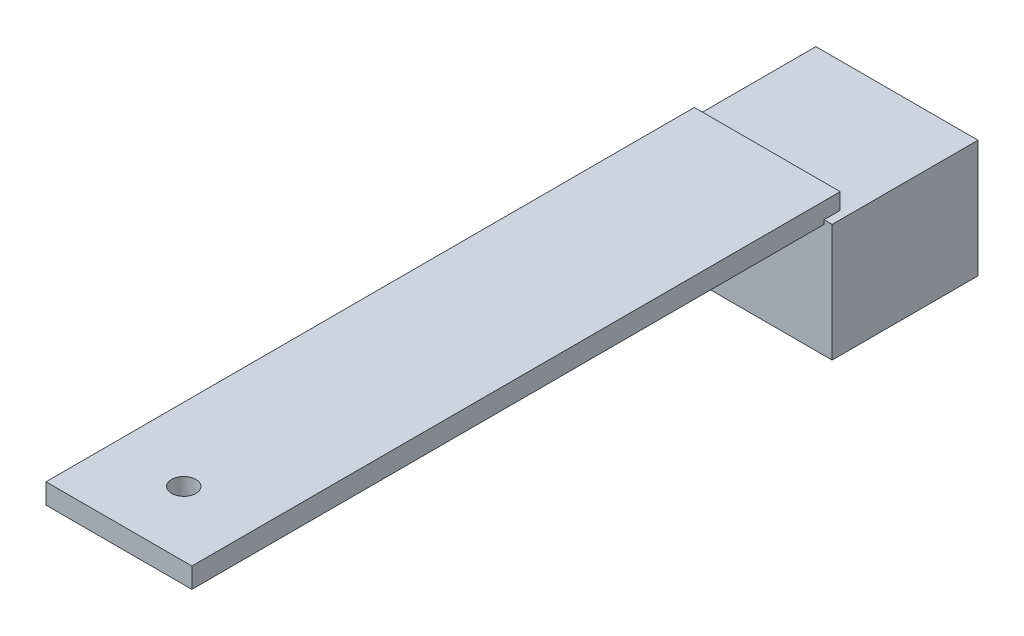
ISO-10303-21;
HEADER;
FILE_DESCRIPTION(('STEP AP214'),'2;1');
FILE_NAME('part.step','',(''),(''),'','','');
FILE_SCHEMA(('AUTOMOTIVE_DESIGN { 1 0 10303 214 1 1 1 1 }'));
ENDSEC;
DATA;
#1=APPLICATION_CONTEXT('core data for automotive mechanical design processes');
#2=APPLICATION_PROTOCOL_DEFINITION('international standard','automotive_design',2000,#1);
#3=PRODUCT_CONTEXT('',#1,'mechanical');
#4=PRODUCT('Part','Part','',(#3));
#5=PRODUCT_RELATED_PRODUCT_CATEGORY('part','',(#4));
#6=PRODUCT_DEFINITION_FORMATION('','',#4);
#7=PRODUCT_DEFINITION_CONTEXT('part definition',#1,'design');
#8=PRODUCT_DEFINITION('design','',#6,#7);
#9=PRODUCT_DEFINITION_SHAPE('','',#8);
#10=(LENGTH_UNIT() NAMED_UNIT(*) SI_UNIT(.MILLI.,.METRE.));
#11=(NAMED_UNIT(*) PLANE_ANGLE_UNIT() SI_UNIT($,.RADIAN.));
#12=(NAMED_UNIT(*) SI_UNIT($,.STERADIAN.) SOLID_ANGLE_UNIT());
#13=UNCERTAINTY_MEASURE_WITH_UNIT(LENGTH_MEASURE(1.E-05),#10,'distance_accuracy_value','');
#14=(GEOMETRIC_REPRESENTATION_CONTEXT(3) GLOBAL_UNCERTAINTY_ASSIGNED_CONTEXT((#13)) GLOBAL_UNIT_ASSIGNED_CONTEXT((#10,
#11,#12)) REPRESENTATION_CONTEXT('',''));
#15=CARTESIAN_POINT('',(0.,0.,0.));
#16=DIRECTION('',(0.,0.,1.));
#17=DIRECTION('',(1.,0.,0.));
#18=AXIS2_PLACEMENT_3D('',#15,#16,#17);
#19=CARTESIAN_POINT('',(-9.,20.7,7.99999999999999));
#20=DIRECTION('',(1.,0.,0.));
#21=DIRECTION('',(0.,0.,-1.));
#22=AXIS2_PLACEMENT_3D('',#19,#20,#21);
#23=PLANE('',#22);
#24=DIRECTION('',(0.,0.,-1.));
#25=VECTOR('',#24,1.);
#26=CARTESIAN_POINT('',(-9.,18.7,7.99999999999999));
#27=LINE('',#26,#25);
#28=CARTESIAN_POINT('',(-9.,18.7,-70.));
#29=VERTEX_POINT('',#28);
#30=CARTESIAN_POINT('',(-9.,18.7,-72.));
#31=VERTEX_POINT('',#30);
#32=EDGE_CURVE('E53',#29,#31,#27,.T.);
#33=ORIENTED_EDGE('',*,*,#32,.F.);
#34=DIRECTION('',(0.,-1.,0.));
#35=VECTOR('',#34,1.);
#36=CARTESIAN_POINT('',(-9.,20.7,-70.));
#37=LINE('',#36,#35);
#38=CARTESIAN_POINT('',(-9.,18.2,-70.));
#39=VERTEX_POINT('',#38);
#40=EDGE_CURVE('E59',#29,#39,#37,.T.);
#41=ORIENTED_EDGE('',*,*,#40,.T.);
#42=DIRECTION('',(0.,0.,-1.));
#43=VECTOR('',#42,1.);
#44=CARTESIAN_POINT('',(-9.,18.2,7.99999999999999));
#45=LINE('',#44,#43);
#46=CARTESIAN_POINT('',(-9.,18.2,7.99999999999999));
#47=VERTEX_POINT('',#46);
#48=EDGE_CURVE('E177',#47,#39,#45,.T.);
#49=ORIENTED_EDGE('',*,*,#48,.F.);
#50=DIRECTION('',(0.,-1.,0.));
#51=VECTOR('',#50,1.);
#52=CARTESIAN_POINT('',(-9.,20.7,7.99999999999999));
#53=LINE('',#52,#51);
#54=CARTESIAN_POINT('',(-9.,20.7,7.99999999999999));
#55=VERTEX_POINT('',#54);
#56=EDGE_CURVE('E153',#55,#47,#53,.T.);
#57=ORIENTED_EDGE('',*,*,#56,.F.);
#58=DIRECTION('',(0.,0.,-1.));
#59=VECTOR('',#58,1.);
#60=CARTESIAN_POINT('',(-9.,20.7,7.99999999999999));
#61=LINE('',#60,#59);
#62=CARTESIAN_POINT('',(-9.,20.7,-72.));
#63=VERTEX_POINT('',#62);
#64=EDGE_CURVE('E162',#55,#63,#61,.T.);
#65=ORIENTED_EDGE('',*,*,#64,.T.);
#66=DIRECTION('',(0.,-1.,0.));
#67=VECTOR('',#66,1.);
#68=CARTESIAN_POINT('',(-9.,20.7,-72.));
#69=LINE('',#68,#67);
#70=EDGE_CURVE('E155',#63,#31,#69,.T.);
#71=ORIENTED_EDGE('',*,*,#70,.T.);
#72=EDGE_LOOP('',(#33,#41,#49,#57,#65,#71));
#73=FACE_BOUND('',#72,.T.);
#74=ADVANCED_FACE('F39',(#73),#23,.F.);
#75=CARTESIAN_POINT('',(9.,18.2,7.99999999999999));
#76=DIRECTION('',(-1.,0.,0.));
#77=DIRECTION('',(0.,0.,1.));
#78=AXIS2_PLACEMENT_3D('',#75,#76,#77);
#79=PLANE('',#78);
#80=DIRECTION('',(0.,0.,1.));
#81=VECTOR('',#80,1.);
#82=CARTESIAN_POINT('',(9.,18.7,7.99999999999999));
#83=LINE('',#82,#81);
#84=CARTESIAN_POINT('',(9.,18.7,-72.));
#85=VERTEX_POINT('',#84);
#86=CARTESIAN_POINT('',(9.,18.7,-70.));
#87=VERTEX_POINT('',#86);
#88=EDGE_CURVE('E136',#85,#87,#83,.T.);
#89=ORIENTED_EDGE('',*,*,#88,.F.);
#90=DIRECTION('',(0.,1.,0.));
#91=VECTOR('',#90,1.);
#92=CARTESIAN_POINT('',(9.,18.2,-72.));
#93=LINE('',#92,#91);
#94=CARTESIAN_POINT('',(9.,20.7,-72.));
#95=VERTEX_POINT('',#94);
#96=EDGE_CURVE('E164',#85,#95,#93,.T.);
#97=ORIENTED_EDGE('',*,*,#96,.T.);
#98=DIRECTION('',(0.,0.,-1.));
#99=VECTOR('',#98,1.);
#100=CARTESIAN_POINT('',(9.,20.7,7.99999999999999));
#101=LINE('',#100,#99);
#102=CARTESIAN_POINT('',(9.,20.7,7.99999999999999));
#103=VERTEX_POINT('',#102);
#104=EDGE_CURVE('E168',#103,#95,#101,.T.);
#105=ORIENTED_EDGE('',*,*,#104,.F.);
#106=DIRECTION('',(0.,1.,0.));
#107=VECTOR('',#106,1.);
#108=CARTESIAN_POINT('',(9.,18.2,7.99999999999999));
#109=LINE('',#108,#107);
#110=CARTESIAN_POINT('',(9.,18.2,7.99999999999999));
#111=VERTEX_POINT('',#110);
#112=EDGE_CURVE('E157',#111,#103,#109,.T.);
#113=ORIENTED_EDGE('',*,*,#112,.F.);
#114=DIRECTION('',(0.,0.,-1.));
#115=VECTOR('',#114,1.);
#116=CARTESIAN_POINT('',(9.,18.2,7.99999999999999));
#117=LINE('',#116,#115);
#118=CARTESIAN_POINT('',(9.,18.2,-70.));
#119=VERTEX_POINT('',#118);
#120=EDGE_CURVE('E175',#111,#119,#117,.T.);
#121=ORIENTED_EDGE('',*,*,#120,.T.);
#122=DIRECTION('',(0.,1.,0.));
#123=VECTOR('',#122,1.);
#124=CARTESIAN_POINT('',(9.,18.2,-70.));
#125=LINE('',#124,#123);
#126=EDGE_CURVE('E11',#119,#87,#125,.T.);
#127=ORIENTED_EDGE('',*,*,#126,.T.);
#128=EDGE_LOOP('',(#89,#97,#105,#113,#121,#127));
#129=FACE_BOUND('',#128,.T.);
#130=ADVANCED_FACE('F198',(#129),#79,.F.);
#131=CARTESIAN_POINT('',(0.,0.,-72.));
#132=DIRECTION('',(0.,0.,1.));
#133=DIRECTION('',(1.,0.,0.));
#134=AXIS2_PLACEMENT_3D('',#131,#132,#133);
#135=PLANE('',#134);
#136=DIRECTION('',(1.,0.,0.));
#137=VECTOR('',#136,1.);
#138=CARTESIAN_POINT('',(0.,18.7,-72.));
#139=LINE('',#138,#137);
#140=EDGE_CURVE('E50',#31,#85,#139,.T.);
#141=ORIENTED_EDGE('',*,*,#140,.F.);
#142=ORIENTED_EDGE('',*,*,#70,.F.);
#143=DIRECTION('',(-1.,0.,0.));
#144=VECTOR('',#143,1.);
#145=CARTESIAN_POINT('',(9.,20.7,-72.));
#146=LINE('',#145,#144);
#147=EDGE_CURVE('E160',#95,#63,#146,.T.);
#148=ORIENTED_EDGE('',*,*,#147,.F.);
#149=ORIENTED_EDGE('',*,*,#96,.F.);
#150=EDGE_LOOP('',(#141,#142,#148,#149));
#151=FACE_BOUND('',#150,.T.);
#152=ADVANCED_FACE('F189',(#151),#135,.F.);
#153=CARTESIAN_POINT('',(-9.,18.2,7.99999999999999));
#154=DIRECTION('',(0.,1.,0.));
#155=DIRECTION('',(0.,0.,1.));
#156=AXIS2_PLACEMENT_3D('',#153,#154,#155);
#157=PLANE('',#156);
#158=CARTESIAN_POINT('',(0.,18.2,0.));
#159=DIRECTION('',(0.,1.,0.));
#160=DIRECTION('',(0.,0.,1.));
#161=AXIS2_PLACEMENT_3D('',#158,#159,#160);
#162=CIRCLE('',#161,1.5);
#163=CARTESIAN_POINT('',(0.,18.2,1.5));
#164=VERTEX_POINT('',#163);
#165=EDGE_CURVE('E209',#164,#164,#162,.F.);
#166=ORIENTED_EDGE('',*,*,#165,.F.);
#167=EDGE_LOOP('',(#166));
#168=FACE_BOUND('',#167,.T.);
#169=ORIENTED_EDGE('',*,*,#48,.T.);
#170=DIRECTION('',(1.,0.,0.));
#171=VECTOR('',#170,1.);
#172=CARTESIAN_POINT('',(-9.,18.2,-70.));
#173=LINE('',#172,#171);
#174=EDGE_CURVE('E149',#39,#119,#173,.T.);
#175=ORIENTED_EDGE('',*,*,#174,.T.);
#176=ORIENTED_EDGE('',*,*,#120,.F.);
#177=DIRECTION('',(1.,0.,0.));
#178=VECTOR('',#177,1.);
#179=CARTESIAN_POINT('',(-9.,18.2,7.99999999999999));
#180=LINE('',#179,#178);
#181=EDGE_CURVE('E156',#47,#111,#180,.T.);
#182=ORIENTED_EDGE('',*,*,#181,.F.);
#183=EDGE_LOOP('',(#169,#175,#176,#182));
#184=FACE_BOUND('',#183,.T.);
#185=ADVANCED_FACE('F239',(#168,#184),#157,.F.);
#186=CARTESIAN_POINT('',(9.,20.7,7.99999999999999));
#187=DIRECTION('',(0.,-1.,0.));
#188=DIRECTION('',(0.,0.,-1.));
#189=AXIS2_PLACEMENT_3D('',#186,#187,#188);
#190=PLANE('',#189);
#191=CARTESIAN_POINT('',(0.,20.7,0.));
#192=DIRECTION('',(0.,-1.,0.));
#193=DIRECTION('',(0.,0.,-1.));
#194=AXIS2_PLACEMENT_3D('',#191,#192,#193);
#195=CIRCLE('',#194,1.5);
#196=CARTESIAN_POINT('',(0.,20.7,-1.5));
#197=VERTEX_POINT('',#196);
#198=EDGE_CURVE('E45',#197,#197,#195,.F.);
#199=ORIENTED_EDGE('',*,*,#198,.F.);
#200=EDGE_LOOP('',(#199));
#201=FACE_BOUND('',#200,.T.);
#202=ORIENTED_EDGE('',*,*,#147,.T.);
#203=ORIENTED_EDGE('',*,*,#64,.F.);
#204=DIRECTION('',(-1.,0.,0.));
#205=VECTOR('',#204,1.);
#206=CARTESIAN_POINT('',(9.,20.7,7.99999999999999));
#207=LINE('',#206,#205);
#208=EDGE_CURVE('E161',#103,#55,#207,.T.);
#209=ORIENTED_EDGE('',*,*,#208,.F.);
#210=ORIENTED_EDGE('',*,*,#104,.T.);
#211=EDGE_LOOP('',(#202,#203,#209,#210));
#212=FACE_BOUND('',#211,.T.);
#213=ADVANCED_FACE('F195',(#201,#212),#190,.F.);
#214=CARTESIAN_POINT('',(0.,0.,7.99999999999999));
#215=DIRECTION('',(0.,0.,1.));
#216=DIRECTION('',(1.,0.,0.));
#217=AXIS2_PLACEMENT_3D('',#214,#215,#216);
#218=PLANE('',#217);
#219=ORIENTED_EDGE('',*,*,#56,.T.);
#220=ORIENTED_EDGE('',*,*,#181,.T.);
#221=ORIENTED_EDGE('',*,*,#112,.T.);
#222=ORIENTED_EDGE('',*,*,#208,.T.);
#223=EDGE_LOOP('',(#219,#220,#221,#222));
#224=FACE_BOUND('',#223,.T.);
#225=ADVANCED_FACE('F250',(#224),#218,.T.);
#226=CARTESIAN_POINT('',(0.,0.,-70.));
#227=DIRECTION('',(0.,0.,1.));
#228=DIRECTION('',(1.,0.,0.));
#229=AXIS2_PLACEMENT_3D('',#226,#227,#228);
#230=PLANE('',#229);
#231=ORIENTED_EDGE('',*,*,#40,.F.);
#232=DIRECTION('',(-1.,0.,0.));
#233=VECTOR('',#232,1.);
#234=CARTESIAN_POINT('',(10.,18.7,-70.));
#235=LINE('',#234,#233);
#236=CARTESIAN_POINT('',(-10.,18.7,-70.));
#237=VERTEX_POINT('',#236);
#238=EDGE_CURVE('E134',#29,#237,#235,.T.);
#239=ORIENTED_EDGE('',*,*,#238,.T.);
#240=DIRECTION('',(0.,-1.,0.));
#241=VECTOR('',#240,1.);
#242=CARTESIAN_POINT('',(-10.,18.7,-70.));
#243=LINE('',#242,#241);
#244=CARTESIAN_POINT('',(-10.,4.2,-70.));
#245=VERTEX_POINT('',#244);
#246=EDGE_CURVE('E127',#237,#245,#243,.T.);
#247=ORIENTED_EDGE('',*,*,#246,.T.);
#248=DIRECTION('',(1.,0.,0.));
#249=VECTOR('',#248,1.);
#250=CARTESIAN_POINT('',(-10.,4.2,-70.));
#251=LINE('',#250,#249);
#252=CARTESIAN_POINT('',(10.,4.2,-70.));
#253=VERTEX_POINT('',#252);
#254=EDGE_CURVE('E113',#245,#253,#251,.T.);
#255=ORIENTED_EDGE('',*,*,#254,.T.);
#256=DIRECTION('',(0.,1.,0.));
#257=VECTOR('',#256,1.);
#258=CARTESIAN_POINT('',(10.,4.2,-70.));
#259=LINE('',#258,#257);
#260=CARTESIAN_POINT('',(10.,18.7,-70.));
#261=VERTEX_POINT('',#260);
#262=EDGE_CURVE('E121',#253,#261,#259,.T.);
#263=ORIENTED_EDGE('',*,*,#262,.T.);
#264=EDGE_CURVE('E199',#261,#87,#235,.T.);
#265=ORIENTED_EDGE('',*,*,#264,.T.);
#266=ORIENTED_EDGE('',*,*,#126,.F.);
#267=ORIENTED_EDGE('',*,*,#174,.F.);
#268=EDGE_LOOP('',(#231,#239,#247,#255,#263,#265,#266,#267));
#269=FACE_BOUND('',#268,.T.);
#270=ADVANCED_FACE('F129',(#269),#230,.T.);
#271=CARTESIAN_POINT('',(10.,18.7,-70.));
#272=DIRECTION('',(0.,-1.,0.));
#273=DIRECTION('',(0.,0.,-1.));
#274=AXIS2_PLACEMENT_3D('',#271,#272,#273);
#275=PLANE('',#274);
#276=ORIENTED_EDGE('',*,*,#238,.F.);
#277=ORIENTED_EDGE('',*,*,#32,.T.);
#278=ORIENTED_EDGE('',*,*,#140,.T.);
#279=ORIENTED_EDGE('',*,*,#88,.T.);
#280=ORIENTED_EDGE('',*,*,#264,.F.);
#281=DIRECTION('',(0.,0.,-1.));
#282=VECTOR('',#281,1.);
#283=CARTESIAN_POINT('',(10.,18.7,-70.));
#284=LINE('',#283,#282);
#285=CARTESIAN_POINT('',(10.,18.7,-88.));
#286=VERTEX_POINT('',#285);
#287=EDGE_CURVE('E145',#261,#286,#284,.T.);
#288=ORIENTED_EDGE('',*,*,#287,.T.);
#289=DIRECTION('',(-1.,0.,0.));
#290=VECTOR('',#289,1.);
#291=CARTESIAN_POINT('',(10.,18.7,-88.));
#292=LINE('',#291,#290);
#293=CARTESIAN_POINT('',(-10.,18.7,-88.));
#294=VERTEX_POINT('',#293);
#295=EDGE_CURVE('E132',#286,#294,#292,.T.);
#296=ORIENTED_EDGE('',*,*,#295,.T.);
#297=DIRECTION('',(0.,0.,-1.));
#298=VECTOR('',#297,1.);
#299=CARTESIAN_POINT('',(-10.,18.7,-70.));
#300=LINE('',#299,#298);
#301=EDGE_CURVE('E201',#237,#294,#300,.T.);
#302=ORIENTED_EDGE('',*,*,#301,.F.);
#303=EDGE_LOOP('',(#276,#277,#278,#279,#280,#288,#296,#302));
#304=FACE_BOUND('',#303,.T.);
#305=ADVANCED_FACE('F176',(#304),#275,.F.);
#306=CARTESIAN_POINT('',(-10.,18.7,-70.));
#307=DIRECTION('',(1.,0.,0.));
#308=DIRECTION('',(0.,0.,-1.));
#309=AXIS2_PLACEMENT_3D('',#306,#307,#308);
#310=PLANE('',#309);
#311=DIRECTION('',(0.,-1.,0.));
#312=VECTOR('',#311,1.);
#313=CARTESIAN_POINT('',(-10.,18.7,-88.));
#314=LINE('',#313,#312);
#315=CARTESIAN_POINT('',(-10.,4.2,-88.));
#316=VERTEX_POINT('',#315);
#317=EDGE_CURVE('E139',#294,#316,#314,.T.);
#318=ORIENTED_EDGE('',*,*,#317,.T.);
#319=DIRECTION('',(0.,0.,-1.));
#320=VECTOR('',#319,1.);
#321=CARTESIAN_POINT('',(-10.,4.2,-70.));
#322=LINE('',#321,#320);
#323=EDGE_CURVE('E118',#245,#316,#322,.T.);
#324=ORIENTED_EDGE('',*,*,#323,.F.);
#325=ORIENTED_EDGE('',*,*,#246,.F.);
#326=ORIENTED_EDGE('',*,*,#301,.T.);
#327=EDGE_LOOP('',(#318,#324,#325,#326));
#328=FACE_BOUND('',#327,.T.);
#329=ADVANCED_FACE('F140',(#328),#310,.F.);
#330=CARTESIAN_POINT('',(-10.,4.2,-70.));
#331=DIRECTION('',(0.,1.,0.));
#332=DIRECTION('',(0.,0.,1.));
#333=AXIS2_PLACEMENT_3D('',#330,#331,#332);
#334=PLANE('',#333);
#335=DIRECTION('',(1.,0.,0.));
#336=VECTOR('',#335,1.);
#337=CARTESIAN_POINT('',(-10.,4.2,-88.));
#338=LINE('',#337,#336);
#339=CARTESIAN_POINT('',(10.,4.2,-88.));
#340=VERTEX_POINT('',#339);
#341=EDGE_CURVE('E207',#316,#340,#338,.T.);
#342=ORIENTED_EDGE('',*,*,#341,.T.);
#343=DIRECTION('',(0.,0.,-1.));
#344=VECTOR('',#343,1.);
#345=CARTESIAN_POINT('',(10.,4.2,-70.));
#346=LINE('',#345,#344);
#347=EDGE_CURVE('E125',#253,#340,#346,.T.);
#348=ORIENTED_EDGE('',*,*,#347,.F.);
#349=ORIENTED_EDGE('',*,*,#254,.F.);
#350=ORIENTED_EDGE('',*,*,#323,.T.);
#351=EDGE_LOOP('',(#342,#348,#349,#350));
#352=FACE_BOUND('',#351,.T.);
#353=ADVANCED_FACE('F116',(#352),#334,.F.);
#354=CARTESIAN_POINT('',(10.,4.2,-70.));
#355=DIRECTION('',(-1.,0.,0.));
#356=DIRECTION('',(0.,0.,1.));
#357=AXIS2_PLACEMENT_3D('',#354,#355,#356);
#358=PLANE('',#357);
#359=DIRECTION('',(0.,1.,0.));
#360=VECTOR('',#359,1.);
#361=CARTESIAN_POINT('',(10.,4.2,-88.));
#362=LINE('',#361,#360);
#363=EDGE_CURVE('E215',#340,#286,#362,.T.);
#364=ORIENTED_EDGE('',*,*,#363,.T.);
#365=ORIENTED_EDGE('',*,*,#287,.F.);
#366=ORIENTED_EDGE('',*,*,#262,.F.);
#367=ORIENTED_EDGE('',*,*,#347,.T.);
#368=EDGE_LOOP('',(#364,#365,#366,#367));
#369=FACE_BOUND('',#368,.T.);
#370=ADVANCED_FACE('F218',(#369),#358,.F.);
#371=CARTESIAN_POINT('',(0.,0.,-88.));
#372=DIRECTION('',(0.,0.,1.));
#373=DIRECTION('',(1.,0.,0.));
#374=AXIS2_PLACEMENT_3D('',#371,#372,#373);
#375=PLANE('',#374);
#376=ORIENTED_EDGE('',*,*,#317,.F.);
#377=ORIENTED_EDGE('',*,*,#295,.F.);
#378=ORIENTED_EDGE('',*,*,#363,.F.);
#379=ORIENTED_EDGE('',*,*,#341,.F.);
#380=EDGE_LOOP('',(#376,#377,#378,#379));
#381=FACE_BOUND('',#380,.T.);
#382=ADVANCED_FACE('F217',(#381),#375,.F.);
#383=CARTESIAN_POINT('',(0.,20.8,0.));
#384=DIRECTION('',(0.,-1.,0.));
#385=DIRECTION('',(0.,0.,-1.));
#386=AXIS2_PLACEMENT_3D('',#383,#384,#385);
#387=CYLINDRICAL_SURFACE('',#386,1.5);
#388=ORIENTED_EDGE('',*,*,#198,.T.);
#389=EDGE_LOOP('',(#388));
#390=FACE_BOUND('',#389,.T.);
#391=ORIENTED_EDGE('',*,*,#165,.T.);
#392=EDGE_LOOP('',(#391));
#393=FACE_BOUND('',#392,.T.);
#394=ADVANCED_FACE('F229',(#390,#393),#387,.F.);
#395=CLOSED_SHELL('',(#74,#130,#152,#185,#213,#225,#270,#305,#329,#353,#370,#382,#394));
#396=MANIFOLD_SOLID_BREP('B2',#395);
#397=ADVANCED_BREP_SHAPE_REPRESENTATION('',(#18,#396),#14);
#398=SHAPE_DEFINITION_REPRESENTATION(#9,#397);
ENDSEC;
END-ISO-10303-21;
